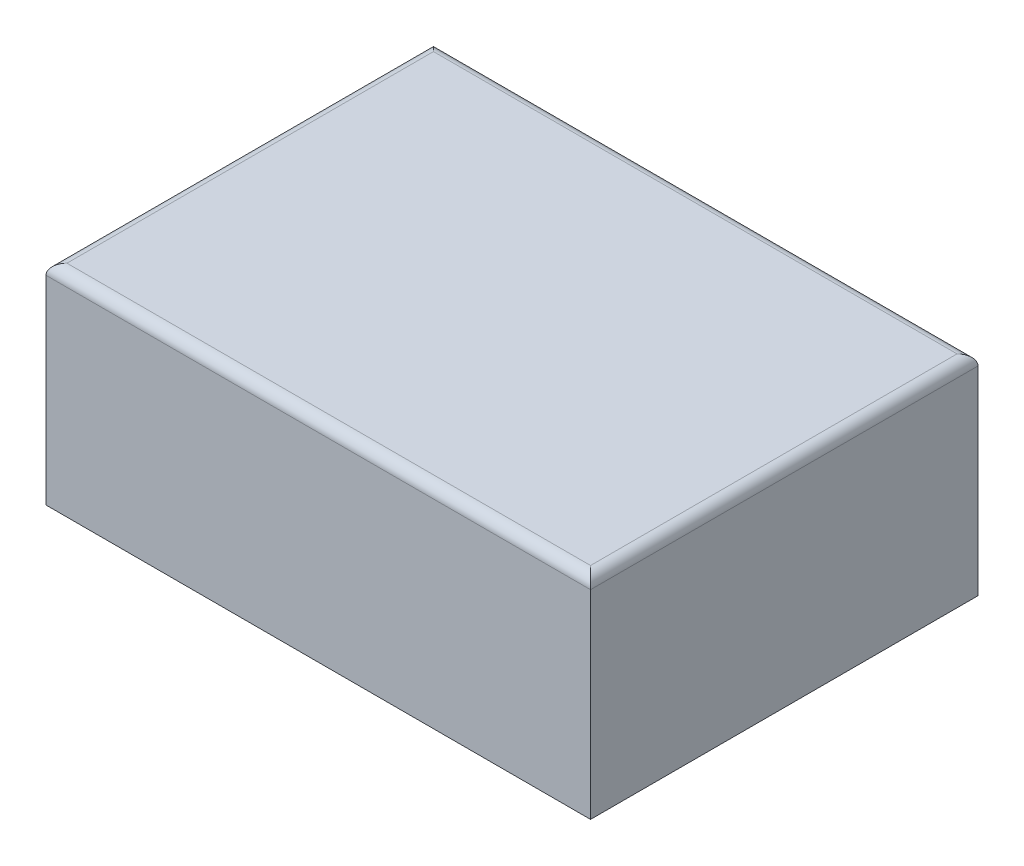
ISO-10303-21;
HEADER;
FILE_DESCRIPTION(('STEP AP214'),'2;1');
FILE_NAME('part.step','',(''),(''),'','','');
FILE_SCHEMA(('AUTOMOTIVE_DESIGN { 1 0 10303 214 1 1 1 1 }'));
ENDSEC;
DATA;
#1=APPLICATION_CONTEXT('core data for automotive mechanical design processes');
#2=APPLICATION_PROTOCOL_DEFINITION('international standard','automotive_design',2000,#1);
#3=PRODUCT_CONTEXT('',#1,'mechanical');
#4=PRODUCT('Part','Part','',(#3));
#5=PRODUCT_RELATED_PRODUCT_CATEGORY('part','',(#4));
#6=PRODUCT_DEFINITION_FORMATION('','',#4);
#7=PRODUCT_DEFINITION_CONTEXT('part definition',#1,'design');
#8=PRODUCT_DEFINITION('design','',#6,#7);
#9=PRODUCT_DEFINITION_SHAPE('','',#8);
#10=(LENGTH_UNIT() NAMED_UNIT(*) SI_UNIT(.MILLI.,.METRE.));
#11=(NAMED_UNIT(*) PLANE_ANGLE_UNIT() SI_UNIT($,.RADIAN.));
#12=(NAMED_UNIT(*) SI_UNIT($,.STERADIAN.) SOLID_ANGLE_UNIT());
#13=UNCERTAINTY_MEASURE_WITH_UNIT(LENGTH_MEASURE(1.E-05),#10,'distance_accuracy_value','');
#14=(GEOMETRIC_REPRESENTATION_CONTEXT(3) GLOBAL_UNCERTAINTY_ASSIGNED_CONTEXT((#13)) GLOBAL_UNIT_ASSIGNED_CONTEXT((#10,
#11,#12)) REPRESENTATION_CONTEXT('',''));
#15=CARTESIAN_POINT('',(0.,0.,0.));
#16=DIRECTION('',(0.,0.,1.));
#17=DIRECTION('',(1.,0.,0.));
#18=AXIS2_PLACEMENT_3D('',#15,#16,#17);
#19=CARTESIAN_POINT('',(-52.3684367456109,39.,-74.728370221328));
#20=DIRECTION('',(1.,0.,0.));
#21=DIRECTION('',(0.,0.,-1.));
#22=AXIS2_PLACEMENT_3D('',#19,#20,#21);
#23=PLANE('',#22);
#24=DIRECTION('',(0.,-1.,0.));
#25=VECTOR('',#24,1.);
#26=CARTESIAN_POINT('',(-52.3684367456109,39.,-74.728370221328));
#27=LINE('',#26,#25);
#28=CARTESIAN_POINT('',(-52.3684367456109,37.,-74.728370221328));
#29=VERTEX_POINT('',#28);
#30=CARTESIAN_POINT('',(-52.3684367456109,0.,-74.728370221328));
#31=VERTEX_POINT('',#30);
#32=EDGE_CURVE('E161',#29,#31,#27,.T.);
#33=ORIENTED_EDGE('',*,*,#32,.F.);
#34=DIRECTION('',(0.,0.,1.));
#35=VECTOR('',#34,1.);
#36=CARTESIAN_POINT('',(-52.3684367456109,37.,-74.728370221328));
#37=LINE('',#36,#35);
#38=CARTESIAN_POINT('',(-52.3684367456109,37.,-4.72837022132798));
#39=VERTEX_POINT('',#38);
#40=EDGE_CURVE('E134',#29,#39,#37,.T.);
#41=ORIENTED_EDGE('',*,*,#40,.T.);
#42=DIRECTION('',(0.,-1.,0.));
#43=VECTOR('',#42,1.);
#44=CARTESIAN_POINT('',(-52.3684367456109,39.,-4.72837022132798));
#45=LINE('',#44,#43);
#46=CARTESIAN_POINT('',(-52.3684367456109,0.,-4.72837022132798));
#47=VERTEX_POINT('',#46);
#48=EDGE_CURVE('E127',#39,#47,#45,.T.);
#49=ORIENTED_EDGE('',*,*,#48,.T.);
#50=DIRECTION('',(0.,0.,1.));
#51=VECTOR('',#50,1.);
#52=CARTESIAN_POINT('',(-52.3684367456109,0.,-74.728370221328));
#53=LINE('',#52,#51);
#54=EDGE_CURVE('E131',#31,#47,#53,.T.);
#55=ORIENTED_EDGE('',*,*,#54,.F.);
#56=EDGE_LOOP('',(#33,#41,#49,#55));
#57=FACE_BOUND('',#56,.T.);
#58=ADVANCED_FACE('F36',(#57),#23,.T.);
#59=CARTESIAN_POINT('',(-52.3684367456109,39.,-4.72837022132798));
#60=DIRECTION('',(0.,0.,-1.));
#61=DIRECTION('',(-1.,0.,0.));
#62=AXIS2_PLACEMENT_3D('',#59,#60,#61);
#63=PLANE('',#62);
#64=ORIENTED_EDGE('',*,*,#48,.F.);
#65=DIRECTION('',(1.,0.,0.));
#66=VECTOR('',#65,1.);
#67=CARTESIAN_POINT('',(-52.3684367456109,37.,-4.72837022132798));
#68=LINE('',#67,#66);
#69=CARTESIAN_POINT('',(47.6315632543891,37.,-4.72837022132798));
#70=VERTEX_POINT('',#69);
#71=EDGE_CURVE('E185',#39,#70,#68,.T.);
#72=ORIENTED_EDGE('',*,*,#71,.T.);
#73=DIRECTION('',(0.,-1.,0.));
#74=VECTOR('',#73,1.);
#75=CARTESIAN_POINT('',(47.6315632543891,39.,-4.72837022132798));
#76=LINE('',#75,#74);
#77=CARTESIAN_POINT('',(47.6315632543891,0.,-4.72837022132798));
#78=VERTEX_POINT('',#77);
#79=EDGE_CURVE('E139',#70,#78,#76,.T.);
#80=ORIENTED_EDGE('',*,*,#79,.T.);
#81=DIRECTION('',(1.,0.,0.));
#82=VECTOR('',#81,1.);
#83=CARTESIAN_POINT('',(-52.3684367456109,0.,-4.72837022132798));
#84=LINE('',#83,#82);
#85=EDGE_CURVE('E142',#47,#78,#84,.T.);
#86=ORIENTED_EDGE('',*,*,#85,.F.);
#87=EDGE_LOOP('',(#64,#72,#80,#86));
#88=FACE_BOUND('',#87,.T.);
#89=ADVANCED_FACE('F143',(#88),#63,.T.);
#90=CARTESIAN_POINT('',(47.6315632543891,39.,-74.728370221328));
#91=DIRECTION('',(-1.,0.,0.));
#92=DIRECTION('',(0.,0.,1.));
#93=AXIS2_PLACEMENT_3D('',#90,#91,#92);
#94=PLANE('',#93);
#95=ORIENTED_EDGE('',*,*,#79,.F.);
#96=DIRECTION('',(0.,0.,-1.));
#97=VECTOR('',#96,1.);
#98=CARTESIAN_POINT('',(47.6315632543891,37.,-74.728370221328));
#99=LINE('',#98,#97);
#100=CARTESIAN_POINT('',(47.6315632543891,37.,-74.728370221328));
#101=VERTEX_POINT('',#100);
#102=EDGE_CURVE('E45',#70,#101,#99,.T.);
#103=ORIENTED_EDGE('',*,*,#102,.T.);
#104=DIRECTION('',(0.,-1.,0.));
#105=VECTOR('',#104,1.);
#106=CARTESIAN_POINT('',(47.6315632543891,39.,-74.728370221328));
#107=LINE('',#106,#105);
#108=CARTESIAN_POINT('',(47.6315632543891,0.,-74.728370221328));
#109=VERTEX_POINT('',#108);
#110=EDGE_CURVE('E163',#101,#109,#107,.T.);
#111=ORIENTED_EDGE('',*,*,#110,.T.);
#112=DIRECTION('',(0.,0.,-1.));
#113=VECTOR('',#112,1.);
#114=CARTESIAN_POINT('',(47.6315632543891,0.,-74.728370221328));
#115=LINE('',#114,#113);
#116=EDGE_CURVE('E148',#78,#109,#115,.T.);
#117=ORIENTED_EDGE('',*,*,#116,.F.);
#118=EDGE_LOOP('',(#95,#103,#111,#117));
#119=FACE_BOUND('',#118,.T.);
#120=ADVANCED_FACE('F270',(#119),#94,.T.);
#121=CARTESIAN_POINT('',(-52.3684367456109,39.,-74.728370221328));
#122=DIRECTION('',(0.,0.,1.));
#123=DIRECTION('',(1.,0.,0.));
#124=AXIS2_PLACEMENT_3D('',#121,#122,#123);
#125=PLANE('',#124);
#126=ORIENTED_EDGE('',*,*,#110,.F.);
#127=DIRECTION('',(-1.,0.,0.));
#128=VECTOR('',#127,1.);
#129=CARTESIAN_POINT('',(-52.3684367456109,37.,-74.728370221328));
#130=LINE('',#129,#128);
#131=EDGE_CURVE('E208',#101,#29,#130,.T.);
#132=ORIENTED_EDGE('',*,*,#131,.T.);
#133=ORIENTED_EDGE('',*,*,#32,.T.);
#134=DIRECTION('',(-1.,0.,0.));
#135=VECTOR('',#134,1.);
#136=CARTESIAN_POINT('',(-52.3684367456109,0.,-74.728370221328));
#137=LINE('',#136,#135);
#138=EDGE_CURVE('E152',#109,#31,#137,.T.);
#139=ORIENTED_EDGE('',*,*,#138,.F.);
#140=EDGE_LOOP('',(#126,#132,#133,#139));
#141=FACE_BOUND('',#140,.T.);
#142=ADVANCED_FACE('F275',(#141),#125,.T.);
#143=CARTESIAN_POINT('',(0.,39.,0.));
#144=DIRECTION('',(0.,1.,0.));
#145=DIRECTION('',(0.,0.,1.));
#146=AXIS2_PLACEMENT_3D('',#143,#144,#145);
#147=PLANE('',#146);
#148=DIRECTION('',(1.,0.,0.));
#149=VECTOR('',#148,1.);
#150=CARTESIAN_POINT('',(0.,39.,-6.72837022132798));
#151=LINE('',#150,#149);
#152=CARTESIAN_POINT('',(45.6315632543891,39.,-6.72837022132798));
#153=VERTEX_POINT('',#152);
#154=CARTESIAN_POINT('',(-50.3684367456109,39.,-6.72837022132798));
#155=VERTEX_POINT('',#154);
#156=EDGE_CURVE('E191',#153,#155,#151,.F.);
#157=ORIENTED_EDGE('',*,*,#156,.T.);
#158=DIRECTION('',(0.,0.,1.));
#159=VECTOR('',#158,1.);
#160=CARTESIAN_POINT('',(-50.3684367456109,39.,0.));
#161=LINE('',#160,#159);
#162=CARTESIAN_POINT('',(-50.3684367456109,39.,-72.728370221328));
#163=VERTEX_POINT('',#162);
#164=EDGE_CURVE('E194',#155,#163,#161,.F.);
#165=ORIENTED_EDGE('',*,*,#164,.T.);
#166=DIRECTION('',(-1.,0.,0.));
#167=VECTOR('',#166,1.);
#168=CARTESIAN_POINT('',(0.,39.,-72.728370221328));
#169=LINE('',#168,#167);
#170=CARTESIAN_POINT('',(45.6315632543891,39.,-72.728370221328));
#171=VERTEX_POINT('',#170);
#172=EDGE_CURVE('E189',#163,#171,#169,.F.);
#173=ORIENTED_EDGE('',*,*,#172,.T.);
#174=DIRECTION('',(0.,0.,-1.));
#175=VECTOR('',#174,1.);
#176=CARTESIAN_POINT('',(45.6315632543891,39.,0.));
#177=LINE('',#176,#175);
#178=EDGE_CURVE('E187',#171,#153,#177,.F.);
#179=ORIENTED_EDGE('',*,*,#178,.T.);
#180=EDGE_LOOP('',(#157,#165,#173,#179));
#181=FACE_BOUND('',#180,.T.);
#182=ADVANCED_FACE('F279',(#181),#147,.F.);
#183=CARTESIAN_POINT('',(0.,0.,0.));
#184=DIRECTION('',(0.,1.,0.));
#185=DIRECTION('',(0.,0.,1.));
#186=AXIS2_PLACEMENT_3D('',#183,#184,#185);
#187=PLANE('',#186);
#188=DIRECTION('',(0.,0.,1.));
#189=VECTOR('',#188,1.);
#190=CARTESIAN_POINT('',(-54.3684367456109,0.,-74.728370221328));
#191=LINE('',#190,#189);
#192=CARTESIAN_POINT('',(-54.3684367456109,0.,-76.728370221328));
#193=VERTEX_POINT('',#192);
#194=CARTESIAN_POINT('',(-54.3684367456109,0.,-2.72837022132798));
#195=VERTEX_POINT('',#194);
#196=EDGE_CURVE('E138',#193,#195,#191,.T.);
#197=ORIENTED_EDGE('',*,*,#196,.F.);
#198=DIRECTION('',(-1.,0.,0.));
#199=VECTOR('',#198,1.);
#200=CARTESIAN_POINT('',(-52.3684367456109,0.,-76.728370221328));
#201=LINE('',#200,#199);
#202=CARTESIAN_POINT('',(49.6315632543891,0.,-76.728370221328));
#203=VERTEX_POINT('',#202);
#204=EDGE_CURVE('E174',#203,#193,#201,.T.);
#205=ORIENTED_EDGE('',*,*,#204,.F.);
#206=DIRECTION('',(0.,0.,-1.));
#207=VECTOR('',#206,1.);
#208=CARTESIAN_POINT('',(49.6315632543891,0.,-74.728370221328));
#209=LINE('',#208,#207);
#210=CARTESIAN_POINT('',(49.6315632543891,0.,-2.72837022132798));
#211=VERTEX_POINT('',#210);
#212=EDGE_CURVE('E171',#211,#203,#209,.T.);
#213=ORIENTED_EDGE('',*,*,#212,.F.);
#214=DIRECTION('',(1.,0.,0.));
#215=VECTOR('',#214,1.);
#216=CARTESIAN_POINT('',(-52.3684367456109,0.,-2.72837022132798));
#217=LINE('',#216,#215);
#218=EDGE_CURVE('E168',#195,#211,#217,.T.);
#219=ORIENTED_EDGE('',*,*,#218,.F.);
#220=EDGE_LOOP('',(#197,#205,#213,#219));
#221=FACE_BOUND('',#220,.T.);
#222=ORIENTED_EDGE('',*,*,#54,.T.);
#223=ORIENTED_EDGE('',*,*,#85,.T.);
#224=ORIENTED_EDGE('',*,*,#116,.T.);
#225=ORIENTED_EDGE('',*,*,#138,.T.);
#226=EDGE_LOOP('',(#222,#223,#224,#225));
#227=FACE_BOUND('',#226,.T.);
#228=ADVANCED_FACE('F150',(#221,#227),#187,.F.);
#229=CARTESIAN_POINT('',(-54.3684367456109,40.,-74.728370221328));
#230=DIRECTION('',(1.,0.,0.));
#231=DIRECTION('',(0.,0.,-1.));
#232=AXIS2_PLACEMENT_3D('',#229,#230,#231);
#233=PLANE('',#232);
#234=DIRECTION('',(0.,-1.,0.));
#235=VECTOR('',#234,1.);
#236=CARTESIAN_POINT('',(-54.3684367456109,40.,-2.72837022132798));
#237=LINE('',#236,#235);
#238=CARTESIAN_POINT('',(-54.3684367456109,38.,-2.72837022132798));
#239=VERTEX_POINT('',#238);
#240=EDGE_CURVE('E183',#239,#195,#237,.T.);
#241=ORIENTED_EDGE('',*,*,#240,.F.);
#242=DIRECTION('',(0.,0.,1.));
#243=VECTOR('',#242,1.);
#244=CARTESIAN_POINT('',(-54.3684367456109,38.,-76.728370221328));
#245=LINE('',#244,#243);
#246=CARTESIAN_POINT('',(-54.3684367456109,38.,-76.728370221328));
#247=VERTEX_POINT('',#246);
#248=EDGE_CURVE('E61',#239,#247,#245,.F.);
#249=ORIENTED_EDGE('',*,*,#248,.T.);
#250=DIRECTION('',(0.,-1.,0.));
#251=VECTOR('',#250,1.);
#252=CARTESIAN_POINT('',(-54.3684367456109,40.,-76.728370221328));
#253=LINE('',#252,#251);
#254=EDGE_CURVE('E177',#247,#193,#253,.T.);
#255=ORIENTED_EDGE('',*,*,#254,.T.);
#256=ORIENTED_EDGE('',*,*,#196,.T.);
#257=EDGE_LOOP('',(#241,#249,#255,#256));
#258=FACE_BOUND('',#257,.T.);
#259=ADVANCED_FACE('F286',(#258),#233,.F.);
#260=CARTESIAN_POINT('',(-52.3684367456109,40.,-2.72837022132798));
#261=DIRECTION('',(0.,0.,-1.));
#262=DIRECTION('',(-1.,0.,0.));
#263=AXIS2_PLACEMENT_3D('',#260,#261,#262);
#264=PLANE('',#263);
#265=DIRECTION('',(0.,-1.,0.));
#266=VECTOR('',#265,1.);
#267=CARTESIAN_POINT('',(49.6315632543891,40.,-2.72837022132798));
#268=LINE('',#267,#266);
#269=CARTESIAN_POINT('',(49.6315632543891,38.,-2.72837022132798));
#270=VERTEX_POINT('',#269);
#271=EDGE_CURVE('E181',#270,#211,#268,.T.);
#272=ORIENTED_EDGE('',*,*,#271,.F.);
#273=DIRECTION('',(1.,0.,0.));
#274=VECTOR('',#273,1.);
#275=CARTESIAN_POINT('',(-54.3684367456109,38.,-2.72837022132798));
#276=LINE('',#275,#274);
#277=EDGE_CURVE('E205',#270,#239,#276,.F.);
#278=ORIENTED_EDGE('',*,*,#277,.T.);
#279=ORIENTED_EDGE('',*,*,#240,.T.);
#280=ORIENTED_EDGE('',*,*,#218,.T.);
#281=EDGE_LOOP('',(#272,#278,#279,#280));
#282=FACE_BOUND('',#281,.T.);
#283=ADVANCED_FACE('F244',(#282),#264,.F.);
#284=CARTESIAN_POINT('',(49.6315632543891,40.,-74.728370221328));
#285=DIRECTION('',(-1.,0.,0.));
#286=DIRECTION('',(0.,0.,1.));
#287=AXIS2_PLACEMENT_3D('',#284,#285,#286);
#288=PLANE('',#287);
#289=DIRECTION('',(0.,-1.,0.));
#290=VECTOR('',#289,1.);
#291=CARTESIAN_POINT('',(49.6315632543891,40.,-76.728370221328));
#292=LINE('',#291,#290);
#293=CARTESIAN_POINT('',(49.6315632543891,38.,-76.728370221328));
#294=VERTEX_POINT('',#293);
#295=EDGE_CURVE('E179',#294,#203,#292,.T.);
#296=ORIENTED_EDGE('',*,*,#295,.F.);
#297=DIRECTION('',(0.,0.,-1.));
#298=VECTOR('',#297,1.);
#299=CARTESIAN_POINT('',(49.6315632543891,38.,-2.72837022132798));
#300=LINE('',#299,#298);
#301=EDGE_CURVE('E11',#294,#270,#300,.F.);
#302=ORIENTED_EDGE('',*,*,#301,.T.);
#303=ORIENTED_EDGE('',*,*,#271,.T.);
#304=ORIENTED_EDGE('',*,*,#212,.T.);
#305=EDGE_LOOP('',(#296,#302,#303,#304));
#306=FACE_BOUND('',#305,.T.);
#307=ADVANCED_FACE('F241',(#306),#288,.F.);
#308=CARTESIAN_POINT('',(-52.3684367456109,40.,-76.728370221328));
#309=DIRECTION('',(0.,0.,1.));
#310=DIRECTION('',(1.,0.,0.));
#311=AXIS2_PLACEMENT_3D('',#308,#309,#310);
#312=PLANE('',#311);
#313=ORIENTED_EDGE('',*,*,#254,.F.);
#314=DIRECTION('',(-1.,0.,0.));
#315=VECTOR('',#314,1.);
#316=CARTESIAN_POINT('',(49.6315632543891,38.,-76.728370221328));
#317=LINE('',#316,#315);
#318=EDGE_CURVE('E53',#247,#294,#317,.F.);
#319=ORIENTED_EDGE('',*,*,#318,.T.);
#320=ORIENTED_EDGE('',*,*,#295,.T.);
#321=ORIENTED_EDGE('',*,*,#204,.T.);
#322=EDGE_LOOP('',(#313,#319,#320,#321));
#323=FACE_BOUND('',#322,.T.);
#324=ADVANCED_FACE('F254',(#323),#312,.F.);
#325=CARTESIAN_POINT('',(0.,40.,0.));
#326=DIRECTION('',(0.,1.,0.));
#327=DIRECTION('',(0.,0.,1.));
#328=AXIS2_PLACEMENT_3D('',#325,#326,#327);
#329=PLANE('',#328);
#330=DIRECTION('',(0.,0.,1.));
#331=VECTOR('',#330,1.);
#332=CARTESIAN_POINT('',(-52.3684367456109,40.,-2.72837022132798));
#333=LINE('',#332,#331);
#334=CARTESIAN_POINT('',(-52.3684367456109,40.,-74.728370221328));
#335=VERTEX_POINT('',#334);
#336=CARTESIAN_POINT('',(-52.3684367456109,40.,-4.72837022132798));
#337=VERTEX_POINT('',#336);
#338=EDGE_CURVE('E200',#335,#337,#333,.T.);
#339=ORIENTED_EDGE('',*,*,#338,.T.);
#340=DIRECTION('',(1.,0.,0.));
#341=VECTOR('',#340,1.);
#342=CARTESIAN_POINT('',(49.6315632543891,40.,-4.72837022132798));
#343=LINE('',#342,#341);
#344=CARTESIAN_POINT('',(47.6315632543891,40.,-4.72837022132798));
#345=VERTEX_POINT('',#344);
#346=EDGE_CURVE('E202',#337,#345,#343,.T.);
#347=ORIENTED_EDGE('',*,*,#346,.T.);
#348=DIRECTION('',(0.,0.,-1.));
#349=VECTOR('',#348,1.);
#350=CARTESIAN_POINT('',(47.6315632543891,40.,-76.728370221328));
#351=LINE('',#350,#349);
#352=CARTESIAN_POINT('',(47.6315632543891,40.,-74.728370221328));
#353=VERTEX_POINT('',#352);
#354=EDGE_CURVE('E196',#345,#353,#351,.T.);
#355=ORIENTED_EDGE('',*,*,#354,.T.);
#356=DIRECTION('',(-1.,0.,0.));
#357=VECTOR('',#356,1.);
#358=CARTESIAN_POINT('',(-54.3684367456109,40.,-74.728370221328));
#359=LINE('',#358,#357);
#360=EDGE_CURVE('E198',#353,#335,#359,.T.);
#361=ORIENTED_EDGE('',*,*,#360,.T.);
#362=EDGE_LOOP('',(#339,#347,#355,#361));
#363=FACE_BOUND('',#362,.T.);
#364=ADVANCED_FACE('F251',(#363),#329,.T.);
#365=CARTESIAN_POINT('',(-52.3684367456109,37.,-72.728370221328));
#366=DIRECTION('',(-1.,0.,0.));
#367=DIRECTION('',(0.,0.,1.));
#368=AXIS2_PLACEMENT_3D('',#365,#366,#367);
#369=CYLINDRICAL_SURFACE('',#368,2.);
#370=CARTESIAN_POINT('',(45.6315632543891,37.,-72.728370221328));
#371=DIRECTION('',(-0.707106781186547,0.,-0.707106781186547));
#372=DIRECTION('',(-0.707106781186547,0.,0.707106781186548));
#373=AXIS2_PLACEMENT_3D('',#370,#371,#372);
#374=ELLIPSE('',#373,2.82842712474619,2.);
#375=EDGE_CURVE('E156',#171,#101,#374,.T.);
#376=ORIENTED_EDGE('',*,*,#375,.F.);
#377=ORIENTED_EDGE('',*,*,#172,.F.);
#378=CARTESIAN_POINT('',(-50.3684367456109,37.,-72.728370221328));
#379=DIRECTION('',(-0.707106781186547,0.,0.707106781186548));
#380=DIRECTION('',(-0.707106781186547,0.,-0.707106781186547));
#381=AXIS2_PLACEMENT_3D('',#378,#379,#380);
#382=ELLIPSE('',#381,2.82842712474619,2.);
#383=EDGE_CURVE('E153',#29,#163,#382,.F.);
#384=ORIENTED_EDGE('',*,*,#383,.F.);
#385=ORIENTED_EDGE('',*,*,#131,.F.);
#386=EDGE_LOOP('',(#376,#377,#384,#385));
#387=FACE_BOUND('',#386,.T.);
#388=ADVANCED_FACE('F253',(#387),#369,.F.);
#389=CARTESIAN_POINT('',(-50.3684367456109,37.,-74.728370221328));
#390=DIRECTION('',(0.,0.,1.));
#391=DIRECTION('',(1.,0.,0.));
#392=AXIS2_PLACEMENT_3D('',#389,#390,#391);
#393=CYLINDRICAL_SURFACE('',#392,2.);
#394=ORIENTED_EDGE('',*,*,#383,.T.);
#395=ORIENTED_EDGE('',*,*,#164,.F.);
#396=CARTESIAN_POINT('',(-50.3684367456109,37.,-6.72837022132798));
#397=DIRECTION('',(0.707106781186547,0.,0.707106781186547));
#398=DIRECTION('',(0.707106781186547,0.,-0.707106781186548));
#399=AXIS2_PLACEMENT_3D('',#396,#397,#398);
#400=ELLIPSE('',#399,2.82842712474619,2.);
#401=EDGE_CURVE('E216',#39,#155,#400,.F.);
#402=ORIENTED_EDGE('',*,*,#401,.F.);
#403=ORIENTED_EDGE('',*,*,#40,.F.);
#404=EDGE_LOOP('',(#394,#395,#402,#403));
#405=FACE_BOUND('',#404,.T.);
#406=ADVANCED_FACE('F260',(#405),#393,.F.);
#407=CARTESIAN_POINT('',(45.6315632543891,37.,-74.728370221328));
#408=DIRECTION('',(0.,0.,-1.));
#409=DIRECTION('',(-1.,0.,0.));
#410=AXIS2_PLACEMENT_3D('',#407,#408,#409);
#411=CYLINDRICAL_SURFACE('',#410,2.);
#412=ORIENTED_EDGE('',*,*,#375,.T.);
#413=ORIENTED_EDGE('',*,*,#102,.F.);
#414=CARTESIAN_POINT('',(45.6315632543891,37.,-6.72837022132798));
#415=DIRECTION('',(0.707106781186547,0.,-0.707106781186548));
#416=DIRECTION('',(0.707106781186547,0.,0.707106781186547));
#417=AXIS2_PLACEMENT_3D('',#414,#415,#416);
#418=ELLIPSE('',#417,2.82842712474619,2.);
#419=EDGE_CURVE('E214',#153,#70,#418,.T.);
#420=ORIENTED_EDGE('',*,*,#419,.F.);
#421=ORIENTED_EDGE('',*,*,#178,.F.);
#422=EDGE_LOOP('',(#412,#413,#420,#421));
#423=FACE_BOUND('',#422,.T.);
#424=ADVANCED_FACE('F298',(#423),#411,.F.);
#425=CARTESIAN_POINT('',(-52.3684367456109,37.,-6.72837022132798));
#426=DIRECTION('',(1.,0.,0.));
#427=DIRECTION('',(0.,0.,-1.));
#428=AXIS2_PLACEMENT_3D('',#425,#426,#427);
#429=CYLINDRICAL_SURFACE('',#428,2.);
#430=ORIENTED_EDGE('',*,*,#401,.T.);
#431=ORIENTED_EDGE('',*,*,#156,.F.);
#432=ORIENTED_EDGE('',*,*,#419,.T.);
#433=ORIENTED_EDGE('',*,*,#71,.F.);
#434=EDGE_LOOP('',(#430,#431,#432,#433));
#435=FACE_BOUND('',#434,.T.);
#436=ADVANCED_FACE('F294',(#435),#429,.F.);
#437=CARTESIAN_POINT('',(0.,38.,-74.728370221328));
#438=DIRECTION('',(1.,0.,0.));
#439=DIRECTION('',(0.,0.,-1.));
#440=AXIS2_PLACEMENT_3D('',#437,#438,#439);
#441=CYLINDRICAL_SURFACE('',#440,2.);
#442=CARTESIAN_POINT('',(47.6315632543891,38.,-74.728370221328));
#443=DIRECTION('',(0.707106781186547,0.,0.707106781186547));
#444=DIRECTION('',(-0.707106781186547,0.,0.707106781186548));
#445=AXIS2_PLACEMENT_3D('',#442,#443,#444);
#446=ELLIPSE('',#445,2.82842712474619,2.);
#447=EDGE_CURVE('E223',#294,#353,#446,.T.);
#448=ORIENTED_EDGE('',*,*,#447,.F.);
#449=ORIENTED_EDGE('',*,*,#318,.F.);
#450=CARTESIAN_POINT('',(-52.3684367456109,38.,-74.728370221328));
#451=DIRECTION('',(0.707106781186547,0.,-0.707106781186548));
#452=DIRECTION('',(0.707106781186547,0.,0.707106781186547));
#453=AXIS2_PLACEMENT_3D('',#450,#451,#452);
#454=ELLIPSE('',#453,2.82842712474619,2.);
#455=EDGE_CURVE('E40',#335,#247,#454,.F.);
#456=ORIENTED_EDGE('',*,*,#455,.F.);
#457=ORIENTED_EDGE('',*,*,#360,.F.);
#458=EDGE_LOOP('',(#448,#449,#456,#457));
#459=FACE_BOUND('',#458,.T.);
#460=ADVANCED_FACE('F38',(#459),#441,.T.);
#461=CARTESIAN_POINT('',(-52.3684367456109,38.,0.));
#462=DIRECTION('',(0.,0.,-1.));
#463=DIRECTION('',(-1.,0.,0.));
#464=AXIS2_PLACEMENT_3D('',#461,#462,#463);
#465=CYLINDRICAL_SURFACE('',#464,2.);
#466=ORIENTED_EDGE('',*,*,#455,.T.);
#467=ORIENTED_EDGE('',*,*,#248,.F.);
#468=CARTESIAN_POINT('',(-52.3684367456109,38.,-4.72837022132798));
#469=DIRECTION('',(-0.707106781186547,0.,-0.707106781186547));
#470=DIRECTION('',(0.707106781186547,0.,-0.707106781186548));
#471=AXIS2_PLACEMENT_3D('',#468,#469,#470);
#472=ELLIPSE('',#471,2.82842712474619,2.);
#473=EDGE_CURVE('E222',#337,#239,#472,.F.);
#474=ORIENTED_EDGE('',*,*,#473,.F.);
#475=ORIENTED_EDGE('',*,*,#338,.F.);
#476=EDGE_LOOP('',(#466,#467,#474,#475));
#477=FACE_BOUND('',#476,.T.);
#478=ADVANCED_FACE('F233',(#477),#465,.T.);
#479=CARTESIAN_POINT('',(47.6315632543891,38.,0.));
#480=DIRECTION('',(0.,0.,1.));
#481=DIRECTION('',(1.,0.,0.));
#482=AXIS2_PLACEMENT_3D('',#479,#480,#481);
#483=CYLINDRICAL_SURFACE('',#482,2.);
#484=ORIENTED_EDGE('',*,*,#447,.T.);
#485=ORIENTED_EDGE('',*,*,#354,.F.);
#486=CARTESIAN_POINT('',(47.6315632543891,38.,-4.72837022132798));
#487=DIRECTION('',(-0.707106781186547,0.,0.707106781186548));
#488=DIRECTION('',(0.707106781186547,0.,0.707106781186547));
#489=AXIS2_PLACEMENT_3D('',#486,#487,#488);
#490=ELLIPSE('',#489,2.82842712474619,2.);
#491=EDGE_CURVE('E220',#270,#345,#490,.T.);
#492=ORIENTED_EDGE('',*,*,#491,.F.);
#493=ORIENTED_EDGE('',*,*,#301,.F.);
#494=EDGE_LOOP('',(#484,#485,#492,#493));
#495=FACE_BOUND('',#494,.T.);
#496=ADVANCED_FACE('F238',(#495),#483,.T.);
#497=CARTESIAN_POINT('',(0.,38.,-4.72837022132798));
#498=DIRECTION('',(-1.,0.,0.));
#499=DIRECTION('',(0.,0.,1.));
#500=AXIS2_PLACEMENT_3D('',#497,#498,#499);
#501=CYLINDRICAL_SURFACE('',#500,2.);
#502=ORIENTED_EDGE('',*,*,#473,.T.);
#503=ORIENTED_EDGE('',*,*,#277,.F.);
#504=ORIENTED_EDGE('',*,*,#491,.T.);
#505=ORIENTED_EDGE('',*,*,#346,.F.);
#506=EDGE_LOOP('',(#502,#503,#504,#505));
#507=FACE_BOUND('',#506,.T.);
#508=ADVANCED_FACE('F248',(#507),#501,.T.);
#509=CLOSED_SHELL('',(#58,#89,#120,#142,#182,#228,#259,#283,#307,#324,#364,#388,#406,#424,#436,
#460,#478,#496,#508));
#510=MANIFOLD_SOLID_BREP('B2',#509);
#511=ADVANCED_BREP_SHAPE_REPRESENTATION('',(#18,#510),#14);
#512=SHAPE_DEFINITION_REPRESENTATION(#9,#511);
ENDSEC;
END-ISO-10303-21;
